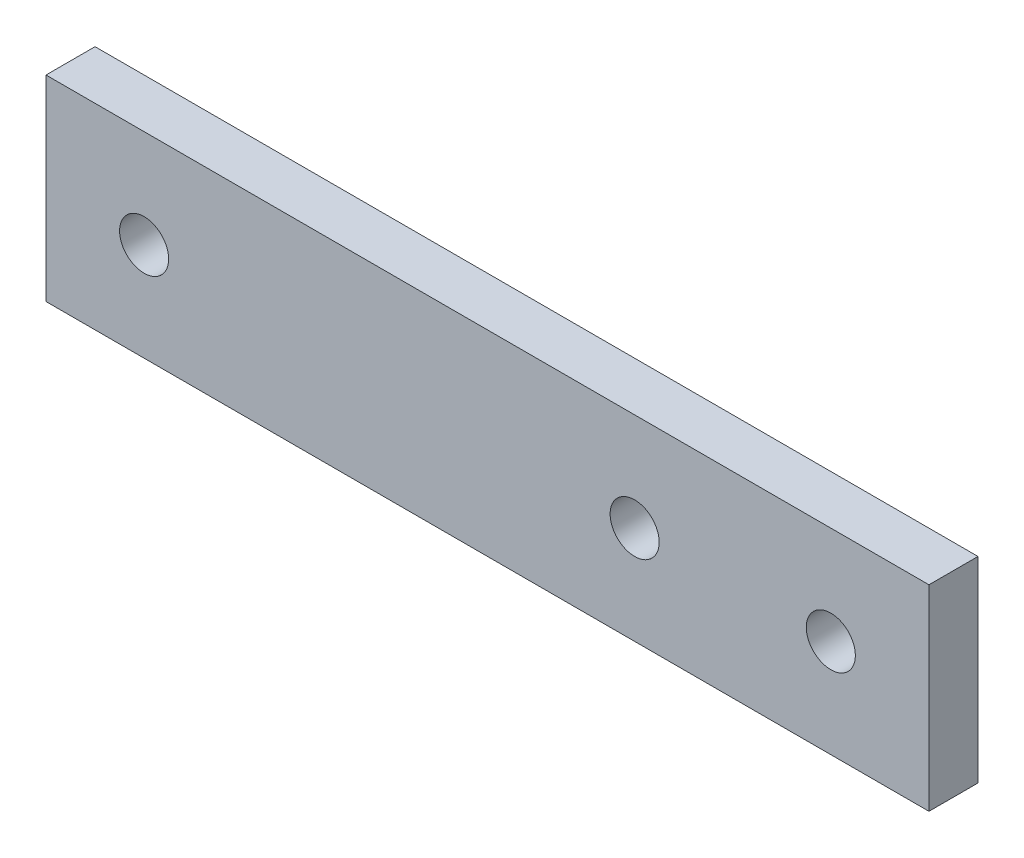
ISO-10303-21;
HEADER;
FILE_DESCRIPTION(('STEP AP214'),'2;1');
FILE_NAME('part.step','',(''),(''),'','','');
FILE_SCHEMA(('AUTOMOTIVE_DESIGN { 1 0 10303 214 1 1 1 1 }'));
ENDSEC;
DATA;
#1=APPLICATION_CONTEXT('core data for automotive mechanical design processes');
#2=APPLICATION_PROTOCOL_DEFINITION('international standard','automotive_design',2000,#1);
#3=PRODUCT_CONTEXT('',#1,'mechanical');
#4=PRODUCT('Part','Part','',(#3));
#5=PRODUCT_RELATED_PRODUCT_CATEGORY('part','',(#4));
#6=PRODUCT_DEFINITION_FORMATION('','',#4);
#7=PRODUCT_DEFINITION_CONTEXT('part definition',#1,'design');
#8=PRODUCT_DEFINITION('design','',#6,#7);
#9=PRODUCT_DEFINITION_SHAPE('','',#8);
#10=(LENGTH_UNIT() NAMED_UNIT(*) SI_UNIT(.MILLI.,.METRE.));
#11=(NAMED_UNIT(*) PLANE_ANGLE_UNIT() SI_UNIT($,.RADIAN.));
#12=(NAMED_UNIT(*) SI_UNIT($,.STERADIAN.) SOLID_ANGLE_UNIT());
#13=UNCERTAINTY_MEASURE_WITH_UNIT(LENGTH_MEASURE(1.E-05),#10,'distance_accuracy_value','');
#14=(GEOMETRIC_REPRESENTATION_CONTEXT(3) GLOBAL_UNCERTAINTY_ASSIGNED_CONTEXT((#13)) GLOBAL_UNIT_ASSIGNED_CONTEXT((#10,
#11,#12)) REPRESENTATION_CONTEXT('',''));
#15=CARTESIAN_POINT('',(0.,0.,0.));
#16=DIRECTION('',(0.,0.,1.));
#17=DIRECTION('',(1.,0.,0.));
#18=AXIS2_PLACEMENT_3D('',#15,#16,#17);
#19=CARTESIAN_POINT('',(114.3,0.,0.));
#20=DIRECTION('',(0.,0.,1.));
#21=DIRECTION('',(1.,0.,0.));
#22=AXIS2_PLACEMENT_3D('',#19,#20,#21);
#23=PLANE('',#22);
#24=CARTESIAN_POINT('',(101.6,12.7,0.));
#25=DIRECTION('',(0.,0.,1.));
#26=DIRECTION('',(1.,0.,0.));
#27=AXIS2_PLACEMENT_3D('',#24,#25,#26);
#28=CIRCLE('',#27,3.175);
#29=CARTESIAN_POINT('',(104.775,12.7,0.));
#30=VERTEX_POINT('',#29);
#31=EDGE_CURVE('E118',#30,#30,#28,.T.);
#32=ORIENTED_EDGE('',*,*,#31,.T.);
#33=EDGE_LOOP('',(#32));
#34=FACE_BOUND('',#33,.T.);
#35=CARTESIAN_POINT('',(76.2,12.7,0.));
#36=DIRECTION('',(0.,0.,1.));
#37=DIRECTION('',(1.,0.,0.));
#38=AXIS2_PLACEMENT_3D('',#35,#36,#37);
#39=CIRCLE('',#38,3.175);
#40=CARTESIAN_POINT('',(79.375,12.7,0.));
#41=VERTEX_POINT('',#40);
#42=EDGE_CURVE('E112',#41,#41,#39,.T.);
#43=ORIENTED_EDGE('',*,*,#42,.T.);
#44=EDGE_LOOP('',(#43));
#45=FACE_BOUND('',#44,.T.);
#46=CARTESIAN_POINT('',(12.7,12.7,0.));
#47=DIRECTION('',(0.,0.,1.));
#48=DIRECTION('',(1.,0.,0.));
#49=AXIS2_PLACEMENT_3D('',#46,#47,#48);
#50=CIRCLE('',#49,3.175);
#51=CARTESIAN_POINT('',(15.875,12.7,0.));
#52=VERTEX_POINT('',#51);
#53=EDGE_CURVE('E98',#52,#52,#50,.T.);
#54=ORIENTED_EDGE('',*,*,#53,.T.);
#55=EDGE_LOOP('',(#54));
#56=FACE_BOUND('',#55,.T.);
#57=DIRECTION('',(0.,1.,0.));
#58=VECTOR('',#57,1.);
#59=CARTESIAN_POINT('',(0.,0.,0.));
#60=LINE('',#59,#58);
#61=CARTESIAN_POINT('',(0.,0.,0.));
#62=VERTEX_POINT('',#61);
#63=CARTESIAN_POINT('',(0.,25.4,0.));
#64=VERTEX_POINT('',#63);
#65=EDGE_CURVE('E95',#62,#64,#60,.T.);
#66=ORIENTED_EDGE('',*,*,#65,.T.);
#67=DIRECTION('',(-1.,0.,0.));
#68=VECTOR('',#67,1.);
#69=CARTESIAN_POINT('',(114.3,25.4,0.));
#70=LINE('',#69,#68);
#71=CARTESIAN_POINT('',(114.3,25.4,0.));
#72=VERTEX_POINT('',#71);
#73=EDGE_CURVE('E11',#72,#64,#70,.T.);
#74=ORIENTED_EDGE('',*,*,#73,.F.);
#75=DIRECTION('',(0.,1.,0.));
#76=VECTOR('',#75,1.);
#77=CARTESIAN_POINT('',(114.3,0.,0.));
#78=LINE('',#77,#76);
#79=CARTESIAN_POINT('',(114.3,0.,0.));
#80=VERTEX_POINT('',#79);
#81=EDGE_CURVE('E83',#80,#72,#78,.T.);
#82=ORIENTED_EDGE('',*,*,#81,.F.);
#83=DIRECTION('',(-1.,0.,0.));
#84=VECTOR('',#83,1.);
#85=CARTESIAN_POINT('',(114.3,0.,0.));
#86=LINE('',#85,#84);
#87=EDGE_CURVE('E91',#80,#62,#86,.T.);
#88=ORIENTED_EDGE('',*,*,#87,.T.);
#89=EDGE_LOOP('',(#66,#74,#82,#88));
#90=FACE_BOUND('',#89,.T.);
#91=ADVANCED_FACE('F32',(#34,#45,#56,#90),#23,.F.);
#92=CARTESIAN_POINT('',(114.3,25.4,0.));
#93=DIRECTION('',(0.,-1.,0.));
#94=DIRECTION('',(0.,0.,-1.));
#95=AXIS2_PLACEMENT_3D('',#92,#93,#94);
#96=PLANE('',#95);
#97=DIRECTION('',(0.,0.,1.));
#98=VECTOR('',#97,1.);
#99=CARTESIAN_POINT('',(0.,25.4,0.));
#100=LINE('',#99,#98);
#101=CARTESIAN_POINT('',(0.,25.4,6.35));
#102=VERTEX_POINT('',#101);
#103=EDGE_CURVE('E87',#64,#102,#100,.T.);
#104=ORIENTED_EDGE('',*,*,#103,.T.);
#105=DIRECTION('',(-1.,0.,0.));
#106=VECTOR('',#105,1.);
#107=CARTESIAN_POINT('',(114.3,25.4,6.35));
#108=LINE('',#107,#106);
#109=CARTESIAN_POINT('',(114.3,25.4,6.35));
#110=VERTEX_POINT('',#109);
#111=EDGE_CURVE('E40',#110,#102,#108,.T.);
#112=ORIENTED_EDGE('',*,*,#111,.F.);
#113=DIRECTION('',(0.,0.,1.));
#114=VECTOR('',#113,1.);
#115=CARTESIAN_POINT('',(114.3,25.4,0.));
#116=LINE('',#115,#114);
#117=EDGE_CURVE('E78',#72,#110,#116,.T.);
#118=ORIENTED_EDGE('',*,*,#117,.F.);
#119=ORIENTED_EDGE('',*,*,#73,.T.);
#120=EDGE_LOOP('',(#104,#112,#118,#119));
#121=FACE_BOUND('',#120,.T.);
#122=ADVANCED_FACE('F86',(#121),#96,.F.);
#123=CARTESIAN_POINT('',(114.3,0.,6.35));
#124=DIRECTION('',(0.,0.,-1.));
#125=DIRECTION('',(0.,1.,0.));
#126=AXIS2_PLACEMENT_3D('',#123,#124,#125);
#127=PLANE('',#126);
#128=CARTESIAN_POINT('',(101.6,12.7,6.35));
#129=DIRECTION('',(0.,0.,1.));
#130=DIRECTION('',(1.,0.,0.));
#131=AXIS2_PLACEMENT_3D('',#128,#129,#130);
#132=CIRCLE('',#131,3.175);
#133=CARTESIAN_POINT('',(104.775,12.7,6.35));
#134=VERTEX_POINT('',#133);
#135=EDGE_CURVE('E121',#134,#134,#132,.T.);
#136=ORIENTED_EDGE('',*,*,#135,.F.);
#137=EDGE_LOOP('',(#136));
#138=FACE_BOUND('',#137,.T.);
#139=CARTESIAN_POINT('',(76.2,12.7,6.35));
#140=DIRECTION('',(0.,0.,1.));
#141=DIRECTION('',(1.,0.,0.));
#142=AXIS2_PLACEMENT_3D('',#139,#140,#141);
#143=CIRCLE('',#142,3.175);
#144=CARTESIAN_POINT('',(79.375,12.7,6.35));
#145=VERTEX_POINT('',#144);
#146=EDGE_CURVE('E115',#145,#145,#143,.T.);
#147=ORIENTED_EDGE('',*,*,#146,.F.);
#148=EDGE_LOOP('',(#147));
#149=FACE_BOUND('',#148,.T.);
#150=CARTESIAN_POINT('',(12.7,12.7,6.35));
#151=DIRECTION('',(0.,0.,1.));
#152=DIRECTION('',(1.,0.,0.));
#153=AXIS2_PLACEMENT_3D('',#150,#151,#152);
#154=CIRCLE('',#153,3.175);
#155=CARTESIAN_POINT('',(15.875,12.7,6.35));
#156=VERTEX_POINT('',#155);
#157=EDGE_CURVE('E109',#156,#156,#154,.T.);
#158=ORIENTED_EDGE('',*,*,#157,.F.);
#159=EDGE_LOOP('',(#158));
#160=FACE_BOUND('',#159,.T.);
#161=DIRECTION('',(0.,-1.,0.));
#162=VECTOR('',#161,1.);
#163=CARTESIAN_POINT('',(0.,0.,6.35));
#164=LINE('',#163,#162);
#165=CARTESIAN_POINT('',(0.,0.,6.35));
#166=VERTEX_POINT('',#165);
#167=EDGE_CURVE('E65',#102,#166,#164,.T.);
#168=ORIENTED_EDGE('',*,*,#167,.T.);
#169=DIRECTION('',(-1.,0.,0.));
#170=VECTOR('',#169,1.);
#171=CARTESIAN_POINT('',(114.3,0.,6.35));
#172=LINE('',#171,#170);
#173=CARTESIAN_POINT('',(114.3,0.,6.35));
#174=VERTEX_POINT('',#173);
#175=EDGE_CURVE('E88',#174,#166,#172,.T.);
#176=ORIENTED_EDGE('',*,*,#175,.F.);
#177=DIRECTION('',(0.,-1.,0.));
#178=VECTOR('',#177,1.);
#179=CARTESIAN_POINT('',(114.3,0.,6.35));
#180=LINE('',#179,#178);
#181=EDGE_CURVE('E81',#110,#174,#180,.T.);
#182=ORIENTED_EDGE('',*,*,#181,.F.);
#183=ORIENTED_EDGE('',*,*,#111,.T.);
#184=EDGE_LOOP('',(#168,#176,#182,#183));
#185=FACE_BOUND('',#184,.T.);
#186=ADVANCED_FACE('F89',(#138,#149,#160,#185),#127,.F.);
#187=CARTESIAN_POINT('',(114.3,0.,0.));
#188=DIRECTION('',(0.,1.,0.));
#189=DIRECTION('',(0.,0.,1.));
#190=AXIS2_PLACEMENT_3D('',#187,#188,#189);
#191=PLANE('',#190);
#192=DIRECTION('',(0.,0.,-1.));
#193=VECTOR('',#192,1.);
#194=CARTESIAN_POINT('',(0.,0.,0.));
#195=LINE('',#194,#193);
#196=EDGE_CURVE('E71',#166,#62,#195,.T.);
#197=ORIENTED_EDGE('',*,*,#196,.T.);
#198=ORIENTED_EDGE('',*,*,#87,.F.);
#199=DIRECTION('',(0.,0.,-1.));
#200=VECTOR('',#199,1.);
#201=CARTESIAN_POINT('',(114.3,0.,0.));
#202=LINE('',#201,#200);
#203=EDGE_CURVE('E48',#174,#80,#202,.T.);
#204=ORIENTED_EDGE('',*,*,#203,.F.);
#205=ORIENTED_EDGE('',*,*,#175,.T.);
#206=EDGE_LOOP('',(#197,#198,#204,#205));
#207=FACE_BOUND('',#206,.T.);
#208=ADVANCED_FACE('F103',(#207),#191,.F.);
#209=CARTESIAN_POINT('',(114.3,0.,0.));
#210=DIRECTION('',(1.,0.,0.));
#211=DIRECTION('',(0.,0.,-1.));
#212=AXIS2_PLACEMENT_3D('',#209,#210,#211);
#213=PLANE('',#212);
#214=ORIENTED_EDGE('',*,*,#81,.T.);
#215=ORIENTED_EDGE('',*,*,#117,.T.);
#216=ORIENTED_EDGE('',*,*,#181,.T.);
#217=ORIENTED_EDGE('',*,*,#203,.T.);
#218=EDGE_LOOP('',(#214,#215,#216,#217));
#219=FACE_BOUND('',#218,.T.);
#220=ADVANCED_FACE('F79',(#219),#213,.T.);
#221=CARTESIAN_POINT('',(0.,0.,0.));
#222=DIRECTION('',(1.,0.,0.));
#223=DIRECTION('',(0.,0.,-1.));
#224=AXIS2_PLACEMENT_3D('',#221,#222,#223);
#225=PLANE('',#224);
#226=ORIENTED_EDGE('',*,*,#65,.F.);
#227=ORIENTED_EDGE('',*,*,#196,.F.);
#228=ORIENTED_EDGE('',*,*,#167,.F.);
#229=ORIENTED_EDGE('',*,*,#103,.F.);
#230=EDGE_LOOP('',(#226,#227,#228,#229));
#231=FACE_BOUND('',#230,.T.);
#232=ADVANCED_FACE('F106',(#231),#225,.F.);
#233=CARTESIAN_POINT('',(12.7,12.7,0.));
#234=DIRECTION('',(0.,0.,1.));
#235=DIRECTION('',(1.,0.,0.));
#236=AXIS2_PLACEMENT_3D('',#233,#234,#235);
#237=CYLINDRICAL_SURFACE('',#236,3.175);
#238=ORIENTED_EDGE('',*,*,#53,.F.);
#239=EDGE_LOOP('',(#238));
#240=FACE_BOUND('',#239,.T.);
#241=ORIENTED_EDGE('',*,*,#157,.T.);
#242=EDGE_LOOP('',(#241));
#243=FACE_BOUND('',#242,.T.);
#244=ADVANCED_FACE('F143',(#240,#243),#237,.F.);
#245=CARTESIAN_POINT('',(76.2,12.7,0.));
#246=DIRECTION('',(0.,0.,1.));
#247=DIRECTION('',(1.,0.,0.));
#248=AXIS2_PLACEMENT_3D('',#245,#246,#247);
#249=CYLINDRICAL_SURFACE('',#248,3.175);
#250=ORIENTED_EDGE('',*,*,#42,.F.);
#251=EDGE_LOOP('',(#250));
#252=FACE_BOUND('',#251,.T.);
#253=ORIENTED_EDGE('',*,*,#146,.T.);
#254=EDGE_LOOP('',(#253));
#255=FACE_BOUND('',#254,.T.);
#256=ADVANCED_FACE('F132',(#252,#255),#249,.F.);
#257=CARTESIAN_POINT('',(101.6,12.7,0.));
#258=DIRECTION('',(0.,0.,1.));
#259=DIRECTION('',(1.,0.,0.));
#260=AXIS2_PLACEMENT_3D('',#257,#258,#259);
#261=CYLINDRICAL_SURFACE('',#260,3.175);
#262=ORIENTED_EDGE('',*,*,#31,.F.);
#263=EDGE_LOOP('',(#262));
#264=FACE_BOUND('',#263,.T.);
#265=ORIENTED_EDGE('',*,*,#135,.T.);
#266=EDGE_LOOP('',(#265));
#267=FACE_BOUND('',#266,.T.);
#268=ADVANCED_FACE('F129',(#264,#267),#261,.F.);
#269=CLOSED_SHELL('',(#91,#122,#186,#208,#220,#232,#244,#256,#268));
#270=MANIFOLD_SOLID_BREP('B2',#269);
#271=ADVANCED_BREP_SHAPE_REPRESENTATION('',(#18,#270),#14);
#272=SHAPE_DEFINITION_REPRESENTATION(#9,#271);
ENDSEC;
END-ISO-10303-21;
